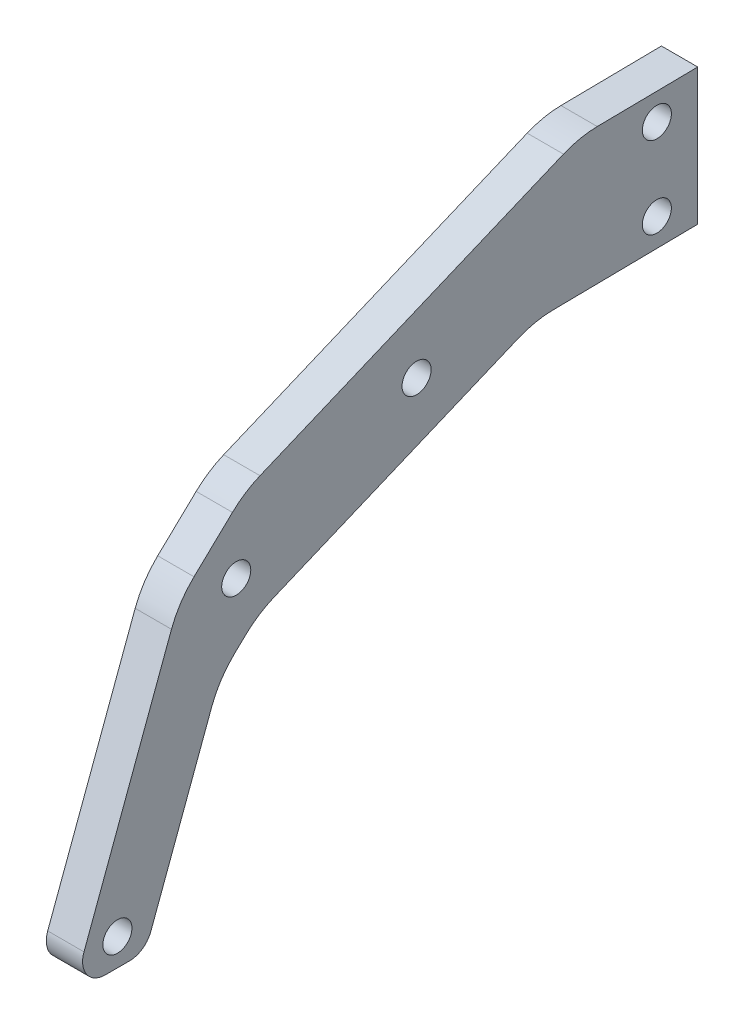
ISO-10303-21;
HEADER;
FILE_DESCRIPTION(('STEP AP214'),'2;1');
FILE_NAME('part.step','',(''),(''),'','','');
FILE_SCHEMA(('AUTOMOTIVE_DESIGN { 1 0 10303 214 1 1 1 1 }'));
ENDSEC;
DATA;
#1=APPLICATION_CONTEXT('core data for automotive mechanical design processes');
#2=APPLICATION_PROTOCOL_DEFINITION('international standard','automotive_design',2000,#1);
#3=PRODUCT_CONTEXT('',#1,'mechanical');
#4=PRODUCT('Part','Part','',(#3));
#5=PRODUCT_RELATED_PRODUCT_CATEGORY('part','',(#4));
#6=PRODUCT_DEFINITION_FORMATION('','',#4);
#7=PRODUCT_DEFINITION_CONTEXT('part definition',#1,'design');
#8=PRODUCT_DEFINITION('design','',#6,#7);
#9=PRODUCT_DEFINITION_SHAPE('','',#8);
#10=(LENGTH_UNIT() NAMED_UNIT(*) SI_UNIT(.MILLI.,.METRE.));
#11=(NAMED_UNIT(*) PLANE_ANGLE_UNIT() SI_UNIT($,.RADIAN.));
#12=(NAMED_UNIT(*) SI_UNIT($,.STERADIAN.) SOLID_ANGLE_UNIT());
#13=UNCERTAINTY_MEASURE_WITH_UNIT(LENGTH_MEASURE(1.E-05),#10,'distance_accuracy_value','');
#14=(GEOMETRIC_REPRESENTATION_CONTEXT(3) GLOBAL_UNCERTAINTY_ASSIGNED_CONTEXT((#13)) GLOBAL_UNIT_ASSIGNED_CONTEXT((#10,
#11,#12)) REPRESENTATION_CONTEXT('',''));
#15=CARTESIAN_POINT('',(0.,0.,0.));
#16=DIRECTION('',(0.,0.,1.));
#17=DIRECTION('',(1.,0.,0.));
#18=AXIS2_PLACEMENT_3D('',#15,#16,#17);
#19=CARTESIAN_POINT('',(4.,2.5,-3.59462739380501));
#20=DIRECTION('',(-1.,0.,0.));
#21=DIRECTION('',(0.,0.,1.));
#22=AXIS2_PLACEMENT_3D('',#19,#20,#21);
#23=PLANE('',#22);
#24=DIRECTION('',(0.,0.0132900137336063,-0.999911683867611));
#25=VECTOR('',#24,1.);
#26=CARTESIAN_POINT('',(4.,53.8051182990518,-55.8458679931572));
#27=LINE('',#26,#25);
#28=CARTESIAN_POINT('',(4.,53.830845917127,-57.7815579350252));
#29=VERTEX_POINT('',#28);
#30=CARTESIAN_POINT('',(4.,53.9778884775887,-68.8447198834361));
#31=VERTEX_POINT('',#30);
#32=EDGE_CURVE('E388',#29,#31,#27,.T.);
#33=ORIENTED_EDGE('',*,*,#32,.F.);
#34=CARTESIAN_POINT('',(4.,43.8317290784509,-57.9144580723613));
#35=DIRECTION('',(-1.,0.,0.));
#36=DIRECTION('',(0.,0.,1.));
#37=AXIS2_PLACEMENT_3D('',#34,#35,#36);
#38=CIRCLE('',#37,10.);
#39=CARTESIAN_POINT('',(4.,53.0588754205989,-54.0596208020497));
#40=VERTEX_POINT('',#39);
#41=EDGE_CURVE('E461',#29,#40,#38,.F.);
#42=ORIENTED_EDGE('',*,*,#41,.T.);
#43=DIRECTION('',(0.,0.385483727031166,-0.922714634214805));
#44=VECTOR('',#43,1.);
#45=CARTESIAN_POINT('',(4.,38.3857692178052,-18.9372826245649));
#46=LINE('',#45,#44);
#47=CARTESIAN_POINT('',(4.,39.0961716849549,-20.6377402746706));
#48=VERTEX_POINT('',#47);
#49=EDGE_CURVE('E385',#48,#40,#46,.T.);
#50=ORIENTED_EDGE('',*,*,#49,.F.);
#51=CARTESIAN_POINT('',(4.,29.8690253428069,-24.4925775449823));
#52=DIRECTION('',(-1.,0.,0.));
#53=DIRECTION('',(0.,0.,1.));
#54=AXIS2_PLACEMENT_3D('',#51,#52,#53);
#55=CIRCLE('',#54,10.);
#56=CARTESIAN_POINT('',(4.,37.1158723932605,-17.6017715088693));
#57=VERTEX_POINT('',#56);
#58=EDGE_CURVE('E249',#48,#57,#55,.F.);
#59=ORIENTED_EDGE('',*,*,#58,.T.);
#60=DIRECTION('',(0.,0.6890806036113,-0.724684705045364));
#61=VECTOR('',#60,1.);
#62=CARTESIAN_POINT('',(4.,31.4949631816922,-11.6904355741113));
#63=LINE('',#62,#61);
#64=CARTESIAN_POINT('',(4.,33.0908033857387,-13.3687312357627));
#65=VERTEX_POINT('',#64);
#66=EDGE_CURVE('E371',#65,#57,#63,.T.);
#67=ORIENTED_EDGE('',*,*,#66,.F.);
#68=CARTESIAN_POINT('',(4.,25.843956335285,-20.2595372718757));
#69=DIRECTION('',(-1.,0.,0.));
#70=DIRECTION('',(0.,0.,1.));
#71=AXIS2_PLACEMENT_3D('',#68,#69,#70);
#72=CIRCLE('',#71,10.);
#73=CARTESIAN_POINT('',(4.,29.3238090620538,-10.8845372718757));
#74=VERTEX_POINT('',#73);
#75=EDGE_CURVE('E243',#65,#74,#72,.F.);
#76=ORIENTED_EDGE('',*,*,#75,.T.);
#77=DIRECTION('',(0.,0.9375,-0.347985272676877));
#78=VECTOR('',#77,1.);
#79=CARTESIAN_POINT('',(4.,3.36996318169219,-1.25087739380501));
#80=LINE('',#79,#78);
#81=CARTESIAN_POINT('',(4.,3.36996318169219,-1.25087739380501));
#82=VERTEX_POINT('',#81);
#83=EDGE_CURVE('E356',#82,#74,#80,.T.);
#84=ORIENTED_EDGE('',*,*,#83,.F.);
#85=CARTESIAN_POINT('',(4.,2.5,-3.59462739380501));
#86=DIRECTION('',(-1.,0.,0.));
#87=DIRECTION('',(0.,0.,1.));
#88=AXIS2_PLACEMENT_3D('',#85,#86,#87);
#89=CIRCLE('',#88,2.5);
#90=CARTESIAN_POINT('',(4.,0.,-3.59462739380501));
#91=VERTEX_POINT('',#90);
#92=EDGE_CURVE('E370',#91,#82,#89,.T.);
#93=ORIENTED_EDGE('',*,*,#92,.F.);
#94=DIRECTION('',(0.,0.,-1.));
#95=VECTOR('',#94,1.);
#96=CARTESIAN_POINT('',(4.,0.,-3.59462739380501));
#97=LINE('',#96,#95);
#98=CARTESIAN_POINT('',(4.,0.,-6.26129406047167));
#99=VERTEX_POINT('',#98);
#100=EDGE_CURVE('E365',#91,#99,#97,.T.);
#101=ORIENTED_EDGE('',*,*,#100,.T.);
#102=CARTESIAN_POINT('',(4.,2.5,-6.26129406047167));
#103=DIRECTION('',(1.,0.,0.));
#104=DIRECTION('',(0.,0.,-1.));
#105=AXIS2_PLACEMENT_3D('',#102,#103,#104);
#106=CIRCLE('',#105,2.5);
#107=CARTESIAN_POINT('',(4.,1.63003681830781,-8.60504406047167));
#108=VERTEX_POINT('',#107);
#109=EDGE_CURVE('E404',#99,#108,#106,.T.);
#110=ORIENTED_EDGE('',*,*,#109,.T.);
#111=DIRECTION('',(0.,0.9375,-0.347985272676877));
#112=VECTOR('',#111,1.);
#113=CARTESIAN_POINT('',(4.,1.63003681830781,-8.60504406047167));
#114=LINE('',#113,#112);
#115=CARTESIAN_POINT('',(4.,19.7540268851558,-15.3323844609038));
#116=VERTEX_POINT('',#115);
#117=EDGE_CURVE('E401',#108,#116,#114,.T.);
#118=ORIENTED_EDGE('',*,*,#117,.T.);
#119=CARTESIAN_POINT('',(4.,16.274174158387,-24.7073844609038));
#120=DIRECTION('',(-1.,0.,0.));
#121=DIRECTION('',(0.,0.,1.));
#122=AXIS2_PLACEMENT_3D('',#119,#120,#121);
#123=CIRCLE('',#122,10.);
#124=CARTESIAN_POINT('',(4.,23.5210212088407,-17.8165784247908));
#125=VERTEX_POINT('',#124);
#126=EDGE_CURVE('E487',#116,#125,#123,.T.);
#127=ORIENTED_EDGE('',*,*,#126,.T.);
#128=DIRECTION('',(0.,0.6890806036113,-0.724684705045364));
#129=VECTOR('',#128,1.);
#130=CARTESIAN_POINT('',(4.,21.9251810047942,-16.1382827631394));
#131=LINE('',#130,#129);
#132=CARTESIAN_POINT('',(4.,24.7329998042288,-19.0911787347068));
#133=VERTEX_POINT('',#132);
#134=EDGE_CURVE('E398',#125,#133,#131,.T.);
#135=ORIENTED_EDGE('',*,*,#134,.T.);
#136=CARTESIAN_POINT('',(4.,17.4861527537751,-25.9819847708198));
#137=DIRECTION('',(-1.,0.,0.));
#138=DIRECTION('',(0.,0.,1.));
#139=AXIS2_PLACEMENT_3D('',#136,#137,#138);
#140=CIRCLE('',#139,10.);
#141=CARTESIAN_POINT('',(4.,26.7132990959232,-22.1271475005082));
#142=VERTEX_POINT('',#141);
#143=EDGE_CURVE('E491',#133,#142,#140,.T.);
#144=ORIENTED_EDGE('',*,*,#143,.T.);
#145=DIRECTION('',(0.,0.385483727031166,-0.922714634214805));
#146=VECTOR('',#145,1.);
#147=CARTESIAN_POINT('',(4.,26.0028966287734,-20.4266898504025));
#148=LINE('',#147,#146);
#149=CARTESIAN_POINT('',(4.,37.9933232946767,-49.1276216389288));
#150=VERTEX_POINT('',#149);
#151=EDGE_CURVE('E395',#142,#150,#148,.T.);
#152=ORIENTED_EDGE('',*,*,#151,.T.);
#153=CARTESIAN_POINT('',(4.,28.7661769525286,-52.9824589092405));
#154=DIRECTION('',(-1.,0.,0.));
#155=DIRECTION('',(0.,0.,1.));
#156=AXIS2_PLACEMENT_3D('',#153,#154,#155);
#157=CIRCLE('',#156,10.);
#158=CARTESIAN_POINT('',(4.,38.7652937912047,-52.8495587719044));
#159=VERTEX_POINT('',#158);
#160=EDGE_CURVE('E12',#150,#159,#157,.T.);
#161=ORIENTED_EDGE('',*,*,#160,.T.);
#162=DIRECTION('',(0.,0.0132900137336063,-0.999911683867611));
#163=VECTOR('',#162,1.);
#164=CARTESIAN_POINT('',(4.,38.7395661731296,-50.9138688300363));
#165=LINE('',#164,#163);
#166=CARTESIAN_POINT('',(4.,38.9778884775887,-68.8447198834361));
#167=VERTEX_POINT('',#166);
#168=EDGE_CURVE('E393',#159,#167,#165,.T.);
#169=ORIENTED_EDGE('',*,*,#168,.T.);
#170=DIRECTION('',(0.,1.,0.));
#171=VECTOR('',#170,1.);
#172=CARTESIAN_POINT('',(4.,38.9778884775887,-68.8447198834361));
#173=LINE('',#172,#171);
#174=EDGE_CURVE('E390',#167,#31,#173,.T.);
#175=ORIENTED_EDGE('',*,*,#174,.T.);
#176=EDGE_LOOP('',(#33,#42,#50,#59,#67,#76,#84,#93,#101,#110,#118,#127,#135,#144,#152,#161,#169,#175));
#177=FACE_BOUND('',#176,.T.);
#178=CARTESIAN_POINT('',(4.,50.9778884775887,-64.3447198834361));
#179=DIRECTION('',(1.,0.,0.));
#180=DIRECTION('',(0.,0.,-1.));
#181=AXIS2_PLACEMENT_3D('',#178,#179,#180);
#182=CIRCLE('',#181,1.60000000000001);
#183=CARTESIAN_POINT('',(4.,50.9778884775887,-65.9447198834361));
#184=VERTEX_POINT('',#183);
#185=EDGE_CURVE('E409',#184,#184,#182,.T.);
#186=ORIENTED_EDGE('',*,*,#185,.F.);
#187=EDGE_LOOP('',(#186));
#188=FACE_BOUND('',#187,.T.);
#189=CARTESIAN_POINT('',(4.,39.7969306114033,-37.8799739940544));
#190=DIRECTION('',(1.,0.,0.));
#191=DIRECTION('',(0.,0.,-1.));
#192=AXIS2_PLACEMENT_3D('',#189,#190,#191);
#193=CIRCLE('',#192,1.60000000000001);
#194=CARTESIAN_POINT('',(4.,39.7969306114033,-39.4799739940544));
#195=VERTEX_POINT('',#194);
#196=EDGE_CURVE('E799',#195,#195,#193,.T.);
#197=ORIENTED_EDGE('',*,*,#196,.F.);
#198=EDGE_LOOP('',(#197));
#199=FACE_BOUND('',#198,.T.);
#200=CARTESIAN_POINT('',(4.,30.6110687670648,-18.0169164153912));
#201=DIRECTION('',(1.,0.,0.));
#202=DIRECTION('',(0.,0.,-1.));
#203=AXIS2_PLACEMENT_3D('',#200,#201,#202);
#204=CIRCLE('',#203,1.6);
#205=CARTESIAN_POINT('',(4.,30.6110687670648,-19.6169164153912));
#206=VERTEX_POINT('',#205);
#207=EDGE_CURVE('E805',#206,#206,#204,.T.);
#208=ORIENTED_EDGE('',*,*,#207,.F.);
#209=EDGE_LOOP('',(#208));
#210=FACE_BOUND('',#209,.T.);
#211=CARTESIAN_POINT('',(4.,3.,-4.92796072713834));
#212=DIRECTION('',(1.,0.,0.));
#213=DIRECTION('',(0.,0.,-1.));
#214=AXIS2_PLACEMENT_3D('',#211,#212,#213);
#215=CIRCLE('',#214,1.6);
#216=CARTESIAN_POINT('',(4.,3.,-6.52796072713834));
#217=VERTEX_POINT('',#216);
#218=EDGE_CURVE('E811',#217,#217,#215,.T.);
#219=ORIENTED_EDGE('',*,*,#218,.F.);
#220=EDGE_LOOP('',(#219));
#221=FACE_BOUND('',#220,.T.);
#222=CARTESIAN_POINT('',(4.,41.9778895515992,-64.3403230449873));
#223=DIRECTION('',(1.,0.,0.));
#224=DIRECTION('',(0.,0.,-1.));
#225=AXIS2_PLACEMENT_3D('',#222,#223,#224);
#226=CIRCLE('',#225,1.60000000000001);
#227=CARTESIAN_POINT('',(4.,41.9778895515992,-65.9403230449873));
#228=VERTEX_POINT('',#227);
#229=EDGE_CURVE('E817',#228,#228,#226,.T.);
#230=ORIENTED_EDGE('',*,*,#229,.F.);
#231=EDGE_LOOP('',(#230));
#232=FACE_BOUND('',#231,.T.);
#233=ADVANCED_FACE('F228',(#177,#188,#199,#210,#221,#232),#23,.F.);
#234=CARTESIAN_POINT('',(0.,2.5,-3.59462739380501));
#235=DIRECTION('',(-1.,0.,0.));
#236=DIRECTION('',(0.,0.,1.));
#237=AXIS2_PLACEMENT_3D('',#234,#235,#236);
#238=PLANE('',#237);
#239=CARTESIAN_POINT('',(0.,3.,-4.92796072713834));
#240=DIRECTION('',(1.,0.,0.));
#241=DIRECTION('',(0.,0.,-1.));
#242=AXIS2_PLACEMENT_3D('',#239,#240,#241);
#243=CIRCLE('',#242,1.6);
#244=CARTESIAN_POINT('',(0.,3.,-6.52796072713834));
#245=VERTEX_POINT('',#244);
#246=EDGE_CURVE('E814',#245,#245,#243,.T.);
#247=ORIENTED_EDGE('',*,*,#246,.T.);
#248=EDGE_LOOP('',(#247));
#249=FACE_BOUND('',#248,.T.);
#250=CARTESIAN_POINT('',(0.,39.7969306114033,-37.8799739940544));
#251=DIRECTION('',(1.,0.,0.));
#252=DIRECTION('',(0.,0.,-1.));
#253=AXIS2_PLACEMENT_3D('',#250,#251,#252);
#254=CIRCLE('',#253,1.60000000000001);
#255=CARTESIAN_POINT('',(0.,39.7969306114033,-39.4799739940544));
#256=VERTEX_POINT('',#255);
#257=EDGE_CURVE('E801',#256,#256,#254,.T.);
#258=ORIENTED_EDGE('',*,*,#257,.T.);
#259=EDGE_LOOP('',(#258));
#260=FACE_BOUND('',#259,.T.);
#261=DIRECTION('',(0.,0.385483727031166,-0.922714634214805));
#262=VECTOR('',#261,1.);
#263=CARTESIAN_POINT('',(0.,38.3857692178052,-18.9372826245649));
#264=LINE('',#263,#262);
#265=CARTESIAN_POINT('',(0.,39.0961716849549,-20.6377402746706));
#266=VERTEX_POINT('',#265);
#267=CARTESIAN_POINT('',(0.,53.0588754205989,-54.0596208020497));
#268=VERTEX_POINT('',#267);
#269=EDGE_CURVE('E414',#266,#268,#264,.T.);
#270=ORIENTED_EDGE('',*,*,#269,.T.);
#271=CARTESIAN_POINT('',(0.,43.8317290784509,-57.9144580723613));
#272=DIRECTION('',(-1.,0.,0.));
#273=DIRECTION('',(0.,0.,1.));
#274=AXIS2_PLACEMENT_3D('',#271,#272,#273);
#275=CIRCLE('',#274,10.);
#276=CARTESIAN_POINT('',(0.,53.830845917127,-57.7815579350252));
#277=VERTEX_POINT('',#276);
#278=EDGE_CURVE('E455',#268,#277,#275,.T.);
#279=ORIENTED_EDGE('',*,*,#278,.T.);
#280=DIRECTION('',(0.,0.0132900137336063,-0.999911683867611));
#281=VECTOR('',#280,1.);
#282=CARTESIAN_POINT('',(0.,53.8051182990518,-55.8458679931572));
#283=LINE('',#282,#281);
#284=CARTESIAN_POINT('',(0.,53.9778884775887,-68.8447198834361));
#285=VERTEX_POINT('',#284);
#286=EDGE_CURVE('E417',#277,#285,#283,.T.);
#287=ORIENTED_EDGE('',*,*,#286,.T.);
#288=DIRECTION('',(0.,1.,0.));
#289=VECTOR('',#288,1.);
#290=CARTESIAN_POINT('',(0.,38.9778884775887,-68.8447198834361));
#291=LINE('',#290,#289);
#292=CARTESIAN_POINT('',(0.,38.9778884775887,-68.8447198834361));
#293=VERTEX_POINT('',#292);
#294=EDGE_CURVE('E419',#293,#285,#291,.T.);
#295=ORIENTED_EDGE('',*,*,#294,.F.);
#296=DIRECTION('',(0.,0.0132900137336063,-0.999911683867611));
#297=VECTOR('',#296,1.);
#298=CARTESIAN_POINT('',(0.,38.7395661731296,-50.9138688300363));
#299=LINE('',#298,#297);
#300=CARTESIAN_POINT('',(0.,38.7652937912047,-52.8495587719044));
#301=VERTEX_POINT('',#300);
#302=EDGE_CURVE('E422',#301,#293,#299,.T.);
#303=ORIENTED_EDGE('',*,*,#302,.F.);
#304=CARTESIAN_POINT('',(0.,28.7661769525286,-52.9824589092405));
#305=DIRECTION('',(-1.,0.,0.));
#306=DIRECTION('',(0.,0.,1.));
#307=AXIS2_PLACEMENT_3D('',#304,#305,#306);
#308=CIRCLE('',#307,10.);
#309=CARTESIAN_POINT('',(0.,37.9933232946767,-49.1276216389288));
#310=VERTEX_POINT('',#309);
#311=EDGE_CURVE('E236',#301,#310,#308,.F.);
#312=ORIENTED_EDGE('',*,*,#311,.T.);
#313=DIRECTION('',(0.,0.385483727031166,-0.922714634214805));
#314=VECTOR('',#313,1.);
#315=CARTESIAN_POINT('',(0.,26.0028966287734,-20.4266898504025));
#316=LINE('',#315,#314);
#317=CARTESIAN_POINT('',(0.,26.7132990959232,-22.1271475005082));
#318=VERTEX_POINT('',#317);
#319=EDGE_CURVE('E424',#318,#310,#316,.T.);
#320=ORIENTED_EDGE('',*,*,#319,.F.);
#321=CARTESIAN_POINT('',(0.,17.4861527537751,-25.9819847708198));
#322=DIRECTION('',(-1.,0.,0.));
#323=DIRECTION('',(0.,0.,1.));
#324=AXIS2_PLACEMENT_3D('',#321,#322,#323);
#325=CIRCLE('',#324,10.);
#326=CARTESIAN_POINT('',(0.,24.7329998042288,-19.0911787347068));
#327=VERTEX_POINT('',#326);
#328=EDGE_CURVE('E489',#318,#327,#325,.F.);
#329=ORIENTED_EDGE('',*,*,#328,.T.);
#330=DIRECTION('',(0.,0.6890806036113,-0.724684705045364));
#331=VECTOR('',#330,1.);
#332=CARTESIAN_POINT('',(0.,21.9251810047942,-16.1382827631394));
#333=LINE('',#332,#331);
#334=CARTESIAN_POINT('',(0.,23.5210212088407,-17.8165784247908));
#335=VERTEX_POINT('',#334);
#336=EDGE_CURVE('E427',#335,#327,#333,.T.);
#337=ORIENTED_EDGE('',*,*,#336,.F.);
#338=CARTESIAN_POINT('',(0.,16.274174158387,-24.7073844609038));
#339=DIRECTION('',(-1.,0.,0.));
#340=DIRECTION('',(0.,0.,1.));
#341=AXIS2_PLACEMENT_3D('',#338,#339,#340);
#342=CIRCLE('',#341,10.);
#343=CARTESIAN_POINT('',(0.,19.7540268851558,-15.3323844609038));
#344=VERTEX_POINT('',#343);
#345=EDGE_CURVE('E485',#335,#344,#342,.F.);
#346=ORIENTED_EDGE('',*,*,#345,.T.);
#347=DIRECTION('',(0.,0.9375,-0.347985272676877));
#348=VECTOR('',#347,1.);
#349=CARTESIAN_POINT('',(0.,1.63003681830781,-8.60504406047167));
#350=LINE('',#349,#348);
#351=CARTESIAN_POINT('',(0.,1.63003681830781,-8.60504406047167));
#352=VERTEX_POINT('',#351);
#353=EDGE_CURVE('E430',#352,#344,#350,.T.);
#354=ORIENTED_EDGE('',*,*,#353,.F.);
#355=CARTESIAN_POINT('',(0.,2.5,-6.26129406047167));
#356=DIRECTION('',(1.,0.,0.));
#357=DIRECTION('',(0.,0.,-1.));
#358=AXIS2_PLACEMENT_3D('',#355,#356,#357);
#359=CIRCLE('',#358,2.5);
#360=CARTESIAN_POINT('',(0.,0.,-6.26129406047167));
#361=VERTEX_POINT('',#360);
#362=EDGE_CURVE('E378',#361,#352,#359,.T.);
#363=ORIENTED_EDGE('',*,*,#362,.F.);
#364=DIRECTION('',(0.,0.,-1.));
#365=VECTOR('',#364,1.);
#366=CARTESIAN_POINT('',(0.,0.,-3.59462739380501));
#367=LINE('',#366,#365);
#368=CARTESIAN_POINT('',(0.,0.,-3.59462739380501));
#369=VERTEX_POINT('',#368);
#370=EDGE_CURVE('E376',#369,#361,#367,.T.);
#371=ORIENTED_EDGE('',*,*,#370,.F.);
#372=CARTESIAN_POINT('',(0.,2.5,-3.59462739380501));
#373=DIRECTION('',(-1.,0.,0.));
#374=DIRECTION('',(0.,0.,1.));
#375=AXIS2_PLACEMENT_3D('',#372,#373,#374);
#376=CIRCLE('',#375,2.5);
#377=CARTESIAN_POINT('',(0.,3.36996318169219,-1.25087739380501));
#378=VERTEX_POINT('',#377);
#379=EDGE_CURVE('E407',#369,#378,#376,.T.);
#380=ORIENTED_EDGE('',*,*,#379,.T.);
#381=DIRECTION('',(0.,0.9375,-0.347985272676877));
#382=VECTOR('',#381,1.);
#383=CARTESIAN_POINT('',(0.,3.36996318169219,-1.25087739380501));
#384=LINE('',#383,#382);
#385=CARTESIAN_POINT('',(0.,29.3238090620538,-10.8845372718757));
#386=VERTEX_POINT('',#385);
#387=EDGE_CURVE('E359',#378,#386,#384,.T.);
#388=ORIENTED_EDGE('',*,*,#387,.T.);
#389=CARTESIAN_POINT('',(0.,25.843956335285,-20.2595372718757));
#390=DIRECTION('',(-1.,0.,0.));
#391=DIRECTION('',(0.,0.,1.));
#392=AXIS2_PLACEMENT_3D('',#389,#390,#391);
#393=CIRCLE('',#392,10.);
#394=CARTESIAN_POINT('',(0.,33.0908033857387,-13.3687312357627));
#395=VERTEX_POINT('',#394);
#396=EDGE_CURVE('E453',#386,#395,#393,.T.);
#397=ORIENTED_EDGE('',*,*,#396,.T.);
#398=DIRECTION('',(0.,0.6890806036113,-0.724684705045364));
#399=VECTOR('',#398,1.);
#400=CARTESIAN_POINT('',(0.,31.4949631816922,-11.6904355741113));
#401=LINE('',#400,#399);
#402=CARTESIAN_POINT('',(0.,37.1158723932605,-17.6017715088693));
#403=VERTEX_POINT('',#402);
#404=EDGE_CURVE('E411',#395,#403,#401,.T.);
#405=ORIENTED_EDGE('',*,*,#404,.T.);
#406=CARTESIAN_POINT('',(0.,29.8690253428069,-24.4925775449823));
#407=DIRECTION('',(-1.,0.,0.));
#408=DIRECTION('',(0.,0.,1.));
#409=AXIS2_PLACEMENT_3D('',#406,#407,#408);
#410=CIRCLE('',#409,10.);
#411=EDGE_CURVE('E451',#403,#266,#410,.T.);
#412=ORIENTED_EDGE('',*,*,#411,.T.);
#413=EDGE_LOOP('',(#270,#279,#287,#295,#303,#312,#320,#329,#337,#346,#354,#363,#371,#380,#388,
#397,#405,#412));
#414=FACE_BOUND('',#413,.T.);
#415=CARTESIAN_POINT('',(0.,50.9778884775887,-64.3447198834361));
#416=DIRECTION('',(1.,0.,0.));
#417=DIRECTION('',(0.,0.,-1.));
#418=AXIS2_PLACEMENT_3D('',#415,#416,#417);
#419=CIRCLE('',#418,1.60000000000001);
#420=CARTESIAN_POINT('',(0.,50.9778884775887,-65.9447198834361));
#421=VERTEX_POINT('',#420);
#422=EDGE_CURVE('E381',#421,#421,#419,.T.);
#423=ORIENTED_EDGE('',*,*,#422,.T.);
#424=EDGE_LOOP('',(#423));
#425=FACE_BOUND('',#424,.T.);
#426=CARTESIAN_POINT('',(0.,30.6110687670648,-18.0169164153912));
#427=DIRECTION('',(1.,0.,0.));
#428=DIRECTION('',(0.,0.,-1.));
#429=AXIS2_PLACEMENT_3D('',#426,#427,#428);
#430=CIRCLE('',#429,1.6);
#431=CARTESIAN_POINT('',(0.,30.6110687670648,-19.6169164153912));
#432=VERTEX_POINT('',#431);
#433=EDGE_CURVE('E808',#432,#432,#430,.T.);
#434=ORIENTED_EDGE('',*,*,#433,.T.);
#435=EDGE_LOOP('',(#434));
#436=FACE_BOUND('',#435,.T.);
#437=CARTESIAN_POINT('',(0.,41.9778895515992,-64.3403230449873));
#438=DIRECTION('',(1.,0.,0.));
#439=DIRECTION('',(0.,0.,-1.));
#440=AXIS2_PLACEMENT_3D('',#437,#438,#439);
#441=CIRCLE('',#440,1.60000000000001);
#442=CARTESIAN_POINT('',(0.,41.9778895515992,-65.9403230449873));
#443=VERTEX_POINT('',#442);
#444=EDGE_CURVE('E820',#443,#443,#441,.T.);
#445=ORIENTED_EDGE('',*,*,#444,.T.);
#446=EDGE_LOOP('',(#445));
#447=FACE_BOUND('',#446,.T.);
#448=ADVANCED_FACE('F495',(#249,#260,#414,#425,#436,#447),#238,.T.);
#449=CARTESIAN_POINT('',(4.,2.5,-3.59462739380501));
#450=DIRECTION('',(-1.,0.,0.));
#451=DIRECTION('',(0.,0.,1.));
#452=AXIS2_PLACEMENT_3D('',#449,#450,#451);
#453=CYLINDRICAL_SURFACE('',#452,2.5);
#454=ORIENTED_EDGE('',*,*,#379,.F.);
#455=DIRECTION('',(-1.,0.,0.));
#456=VECTOR('',#455,1.);
#457=CARTESIAN_POINT('',(4.,0.,-3.59462739380501));
#458=LINE('',#457,#456);
#459=EDGE_CURVE('E374',#91,#369,#458,.T.);
#460=ORIENTED_EDGE('',*,*,#459,.F.);
#461=ORIENTED_EDGE('',*,*,#92,.T.);
#462=DIRECTION('',(-1.,0.,0.));
#463=VECTOR('',#462,1.);
#464=CARTESIAN_POINT('',(4.,3.36996318169219,-1.25087739380501));
#465=LINE('',#464,#463);
#466=EDGE_CURVE('E353',#82,#378,#465,.T.);
#467=ORIENTED_EDGE('',*,*,#466,.T.);
#468=EDGE_LOOP('',(#454,#460,#461,#467));
#469=FACE_BOUND('',#468,.T.);
#470=ADVANCED_FACE('F373',(#469),#453,.T.);
#471=CARTESIAN_POINT('',(4.,0.,-3.59462739380501));
#472=DIRECTION('',(0.,1.,0.));
#473=DIRECTION('',(0.,0.,1.));
#474=AXIS2_PLACEMENT_3D('',#471,#472,#473);
#475=PLANE('',#474);
#476=ORIENTED_EDGE('',*,*,#370,.T.);
#477=DIRECTION('',(-1.,0.,0.));
#478=VECTOR('',#477,1.);
#479=CARTESIAN_POINT('',(4.,0.,-6.26129406047167));
#480=LINE('',#479,#478);
#481=EDGE_CURVE('E436',#99,#361,#480,.T.);
#482=ORIENTED_EDGE('',*,*,#481,.F.);
#483=ORIENTED_EDGE('',*,*,#100,.F.);
#484=ORIENTED_EDGE('',*,*,#459,.T.);
#485=EDGE_LOOP('',(#476,#482,#483,#484));
#486=FACE_BOUND('',#485,.T.);
#487=ADVANCED_FACE('F539',(#486),#475,.F.);
#488=CARTESIAN_POINT('',(4.,2.5,-6.26129406047167));
#489=DIRECTION('',(-1.,0.,0.));
#490=DIRECTION('',(0.,0.,1.));
#491=AXIS2_PLACEMENT_3D('',#488,#489,#490);
#492=CYLINDRICAL_SURFACE('',#491,2.5);
#493=ORIENTED_EDGE('',*,*,#362,.T.);
#494=DIRECTION('',(-1.,0.,0.));
#495=VECTOR('',#494,1.);
#496=CARTESIAN_POINT('',(4.,1.63003681830781,-8.60504406047167));
#497=LINE('',#496,#495);
#498=EDGE_CURVE('E439',#108,#352,#497,.T.);
#499=ORIENTED_EDGE('',*,*,#498,.F.);
#500=ORIENTED_EDGE('',*,*,#109,.F.);
#501=ORIENTED_EDGE('',*,*,#481,.T.);
#502=EDGE_LOOP('',(#493,#499,#500,#501));
#503=FACE_BOUND('',#502,.T.);
#504=ADVANCED_FACE('F542',(#503),#492,.T.);
#505=CARTESIAN_POINT('',(4.,1.63003681830781,-8.60504406047167));
#506=DIRECTION('',(0.,0.347985272676877,0.9375));
#507=DIRECTION('',(0.,-0.9375,0.347985272676877));
#508=AXIS2_PLACEMENT_3D('',#505,#506,#507);
#509=PLANE('',#508);
#510=ORIENTED_EDGE('',*,*,#353,.T.);
#511=DIRECTION('',(-1.,0.,0.));
#512=VECTOR('',#511,1.);
#513=CARTESIAN_POINT('',(4.,19.7540268851558,-15.3323844609038));
#514=LINE('',#513,#512);
#515=EDGE_CURVE('E475',#344,#116,#514,.F.);
#516=ORIENTED_EDGE('',*,*,#515,.T.);
#517=ORIENTED_EDGE('',*,*,#117,.F.);
#518=ORIENTED_EDGE('',*,*,#498,.T.);
#519=EDGE_LOOP('',(#510,#516,#517,#518));
#520=FACE_BOUND('',#519,.T.);
#521=ADVANCED_FACE('F580',(#520),#509,.F.);
#522=CARTESIAN_POINT('',(4.,21.9251810047942,-16.1382827631394));
#523=DIRECTION('',(0.,0.724684705045364,0.6890806036113));
#524=DIRECTION('',(0.,-0.6890806036113,0.724684705045364));
#525=AXIS2_PLACEMENT_3D('',#522,#523,#524);
#526=PLANE('',#525);
#527=ORIENTED_EDGE('',*,*,#134,.F.);
#528=DIRECTION('',(-1.,0.,0.));
#529=VECTOR('',#528,1.);
#530=CARTESIAN_POINT('',(0.,23.5210212088407,-17.8165784247908));
#531=LINE('',#530,#529);
#532=EDGE_CURVE('E472',#125,#335,#531,.T.);
#533=ORIENTED_EDGE('',*,*,#532,.T.);
#534=ORIENTED_EDGE('',*,*,#336,.T.);
#535=DIRECTION('',(-1.,0.,0.));
#536=VECTOR('',#535,1.);
#537=CARTESIAN_POINT('',(4.,24.7329998042288,-19.0911787347068));
#538=LINE('',#537,#536);
#539=EDGE_CURVE('E470',#327,#133,#538,.F.);
#540=ORIENTED_EDGE('',*,*,#539,.T.);
#541=EDGE_LOOP('',(#527,#533,#534,#540));
#542=FACE_BOUND('',#541,.T.);
#543=ADVANCED_FACE('F554',(#542),#526,.F.);
#544=CARTESIAN_POINT('',(4.,26.0028966287734,-20.4266898504025));
#545=DIRECTION('',(0.,0.922714634214805,0.385483727031166));
#546=DIRECTION('',(0.,-0.385483727031166,0.922714634214805));
#547=AXIS2_PLACEMENT_3D('',#544,#545,#546);
#548=PLANE('',#547);
#549=ORIENTED_EDGE('',*,*,#151,.F.);
#550=DIRECTION('',(-1.,0.,0.));
#551=VECTOR('',#550,1.);
#552=CARTESIAN_POINT('',(0.,26.7132990959232,-22.1271475005082));
#553=LINE('',#552,#551);
#554=EDGE_CURVE('E479',#142,#318,#553,.T.);
#555=ORIENTED_EDGE('',*,*,#554,.T.);
#556=ORIENTED_EDGE('',*,*,#319,.T.);
#557=DIRECTION('',(-1.,0.,0.));
#558=VECTOR('',#557,1.);
#559=CARTESIAN_POINT('',(4.,37.9933232946767,-49.1276216389288));
#560=LINE('',#559,#558);
#561=EDGE_CURVE('E477',#310,#150,#560,.F.);
#562=ORIENTED_EDGE('',*,*,#561,.T.);
#563=EDGE_LOOP('',(#549,#555,#556,#562));
#564=FACE_BOUND('',#563,.T.);
#565=ADVANCED_FACE('F503',(#564),#548,.F.);
#566=CARTESIAN_POINT('',(4.,38.7395661731296,-50.9138688300363));
#567=DIRECTION('',(0.,0.999911683867611,0.0132900137336063));
#568=DIRECTION('',(0.,-0.0132900137336063,0.999911683867611));
#569=AXIS2_PLACEMENT_3D('',#566,#567,#568);
#570=PLANE('',#569);
#571=ORIENTED_EDGE('',*,*,#168,.F.);
#572=DIRECTION('',(-1.,0.,0.));
#573=VECTOR('',#572,1.);
#574=CARTESIAN_POINT('',(0.,38.7652937912047,-52.8495587719044));
#575=LINE('',#574,#573);
#576=EDGE_CURVE('E482',#159,#301,#575,.T.);
#577=ORIENTED_EDGE('',*,*,#576,.T.);
#578=ORIENTED_EDGE('',*,*,#302,.T.);
#579=DIRECTION('',(-1.,0.,0.));
#580=VECTOR('',#579,1.);
#581=CARTESIAN_POINT('',(4.,38.9778884775887,-68.8447198834361));
#582=LINE('',#581,#580);
#583=EDGE_CURVE('E442',#167,#293,#582,.T.);
#584=ORIENTED_EDGE('',*,*,#583,.F.);
#585=EDGE_LOOP('',(#571,#577,#578,#584));
#586=FACE_BOUND('',#585,.T.);
#587=ADVANCED_FACE('F509',(#586),#570,.F.);
#588=CARTESIAN_POINT('',(4.,38.9778884775887,-68.8447198834361));
#589=DIRECTION('',(0.,0.,1.));
#590=DIRECTION('',(0.,-1.,0.));
#591=AXIS2_PLACEMENT_3D('',#588,#589,#590);
#592=PLANE('',#591);
#593=ORIENTED_EDGE('',*,*,#294,.T.);
#594=DIRECTION('',(-1.,0.,0.));
#595=VECTOR('',#594,1.);
#596=CARTESIAN_POINT('',(4.,53.9778884775887,-68.8447198834361));
#597=LINE('',#596,#595);
#598=EDGE_CURVE('E364',#31,#285,#597,.T.);
#599=ORIENTED_EDGE('',*,*,#598,.F.);
#600=ORIENTED_EDGE('',*,*,#174,.F.);
#601=ORIENTED_EDGE('',*,*,#583,.T.);
#602=EDGE_LOOP('',(#593,#599,#600,#601));
#603=FACE_BOUND('',#602,.T.);
#604=ADVANCED_FACE('F513',(#603),#592,.F.);
#605=CARTESIAN_POINT('',(4.,53.8051182990518,-55.8458679931572));
#606=DIRECTION('',(0.,0.999911683867611,0.0132900137336063));
#607=DIRECTION('',(0.,-0.0132900137336063,0.999911683867611));
#608=AXIS2_PLACEMENT_3D('',#605,#606,#607);
#609=PLANE('',#608);
#610=ORIENTED_EDGE('',*,*,#286,.F.);
#611=DIRECTION('',(-1.,0.,0.));
#612=VECTOR('',#611,1.);
#613=CARTESIAN_POINT('',(4.,53.830845917127,-57.7815579350252));
#614=LINE('',#613,#612);
#615=EDGE_CURVE('E457',#277,#29,#614,.F.);
#616=ORIENTED_EDGE('',*,*,#615,.T.);
#617=ORIENTED_EDGE('',*,*,#32,.T.);
#618=ORIENTED_EDGE('',*,*,#598,.T.);
#619=EDGE_LOOP('',(#610,#616,#617,#618));
#620=FACE_BOUND('',#619,.T.);
#621=ADVANCED_FACE('F591',(#620),#609,.T.);
#622=CARTESIAN_POINT('',(4.,38.3857692178052,-18.9372826245649));
#623=DIRECTION('',(0.,0.922714634214805,0.385483727031166));
#624=DIRECTION('',(0.,-0.385483727031166,0.922714634214805));
#625=AXIS2_PLACEMENT_3D('',#622,#623,#624);
#626=PLANE('',#625);
#627=ORIENTED_EDGE('',*,*,#49,.T.);
#628=DIRECTION('',(-1.,0.,0.));
#629=VECTOR('',#628,1.);
#630=CARTESIAN_POINT('',(4.,53.0588754205989,-54.0596208020497));
#631=LINE('',#630,#629);
#632=EDGE_CURVE('E448',#40,#268,#631,.T.);
#633=ORIENTED_EDGE('',*,*,#632,.T.);
#634=ORIENTED_EDGE('',*,*,#269,.F.);
#635=DIRECTION('',(-1.,0.,0.));
#636=VECTOR('',#635,1.);
#637=CARTESIAN_POINT('',(4.,39.0961716849549,-20.6377402746706));
#638=LINE('',#637,#636);
#639=EDGE_CURVE('E435',#266,#48,#638,.F.);
#640=ORIENTED_EDGE('',*,*,#639,.T.);
#641=EDGE_LOOP('',(#627,#633,#634,#640));
#642=FACE_BOUND('',#641,.T.);
#643=ADVANCED_FACE('F522',(#642),#626,.T.);
#644=CARTESIAN_POINT('',(4.,31.4949631816922,-11.6904355741113));
#645=DIRECTION('',(0.,0.724684705045364,0.6890806036113));
#646=DIRECTION('',(0.,-0.6890806036113,0.724684705045364));
#647=AXIS2_PLACEMENT_3D('',#644,#645,#646);
#648=PLANE('',#647);
#649=ORIENTED_EDGE('',*,*,#404,.F.);
#650=DIRECTION('',(-1.,0.,0.));
#651=VECTOR('',#650,1.);
#652=CARTESIAN_POINT('',(4.,33.0908033857387,-13.3687312357627));
#653=LINE('',#652,#651);
#654=EDGE_CURVE('E468',#395,#65,#653,.F.);
#655=ORIENTED_EDGE('',*,*,#654,.T.);
#656=ORIENTED_EDGE('',*,*,#66,.T.);
#657=DIRECTION('',(-1.,0.,0.));
#658=VECTOR('',#657,1.);
#659=CARTESIAN_POINT('',(4.,37.1158723932605,-17.6017715088693));
#660=LINE('',#659,#658);
#661=EDGE_CURVE('E465',#57,#403,#660,.T.);
#662=ORIENTED_EDGE('',*,*,#661,.T.);
#663=EDGE_LOOP('',(#649,#655,#656,#662));
#664=FACE_BOUND('',#663,.T.);
#665=ADVANCED_FACE('F530',(#664),#648,.T.);
#666=CARTESIAN_POINT('',(4.,3.36996318169219,-1.25087739380501));
#667=DIRECTION('',(0.,0.347985272676877,0.9375));
#668=DIRECTION('',(0.,-0.9375,0.347985272676877));
#669=AXIS2_PLACEMENT_3D('',#666,#667,#668);
#670=PLANE('',#669);
#671=ORIENTED_EDGE('',*,*,#83,.T.);
#672=DIRECTION('',(-1.,0.,0.));
#673=VECTOR('',#672,1.);
#674=CARTESIAN_POINT('',(4.,29.3238090620538,-10.8845372718757));
#675=LINE('',#674,#673);
#676=EDGE_CURVE('E463',#74,#386,#675,.T.);
#677=ORIENTED_EDGE('',*,*,#676,.T.);
#678=ORIENTED_EDGE('',*,*,#387,.F.);
#679=ORIENTED_EDGE('',*,*,#466,.F.);
#680=EDGE_LOOP('',(#671,#677,#678,#679));
#681=FACE_BOUND('',#680,.T.);
#682=ADVANCED_FACE('F354',(#681),#670,.T.);
#683=CARTESIAN_POINT('',(4.,50.9778884775887,-64.3447198834361));
#684=DIRECTION('',(-1.,0.,0.));
#685=DIRECTION('',(0.,0.,1.));
#686=AXIS2_PLACEMENT_3D('',#683,#684,#685);
#687=CYLINDRICAL_SURFACE('',#686,1.60000000000001);
#688=ORIENTED_EDGE('',*,*,#185,.T.);
#689=EDGE_LOOP('',(#688));
#690=FACE_BOUND('',#689,.T.);
#691=ORIENTED_EDGE('',*,*,#422,.F.);
#692=EDGE_LOOP('',(#691));
#693=FACE_BOUND('',#692,.T.);
#694=ADVANCED_FACE('F573',(#690,#693),#687,.F.);
#695=CARTESIAN_POINT('',(4.,39.7969306114033,-37.8799739940544));
#696=DIRECTION('',(-1.,0.,0.));
#697=DIRECTION('',(0.,0.,1.));
#698=AXIS2_PLACEMENT_3D('',#695,#696,#697);
#699=CYLINDRICAL_SURFACE('',#698,1.60000000000001);
#700=ORIENTED_EDGE('',*,*,#196,.T.);
#701=EDGE_LOOP('',(#700));
#702=FACE_BOUND('',#701,.T.);
#703=ORIENTED_EDGE('',*,*,#257,.F.);
#704=EDGE_LOOP('',(#703));
#705=FACE_BOUND('',#704,.T.);
#706=ADVANCED_FACE('F666',(#702,#705),#699,.F.);
#707=CARTESIAN_POINT('',(4.,30.6110687670648,-18.0169164153912));
#708=DIRECTION('',(-1.,0.,0.));
#709=DIRECTION('',(0.,0.,1.));
#710=AXIS2_PLACEMENT_3D('',#707,#708,#709);
#711=CYLINDRICAL_SURFACE('',#710,1.6);
#712=ORIENTED_EDGE('',*,*,#207,.T.);
#713=EDGE_LOOP('',(#712));
#714=FACE_BOUND('',#713,.T.);
#715=ORIENTED_EDGE('',*,*,#433,.F.);
#716=EDGE_LOOP('',(#715));
#717=FACE_BOUND('',#716,.T.);
#718=ADVANCED_FACE('F657',(#714,#717),#711,.F.);
#719=CARTESIAN_POINT('',(4.,3.,-4.92796072713834));
#720=DIRECTION('',(-1.,0.,0.));
#721=DIRECTION('',(0.,0.,1.));
#722=AXIS2_PLACEMENT_3D('',#719,#720,#721);
#723=CYLINDRICAL_SURFACE('',#722,1.6);
#724=ORIENTED_EDGE('',*,*,#218,.T.);
#725=EDGE_LOOP('',(#724));
#726=FACE_BOUND('',#725,.T.);
#727=ORIENTED_EDGE('',*,*,#246,.F.);
#728=EDGE_LOOP('',(#727));
#729=FACE_BOUND('',#728,.T.);
#730=ADVANCED_FACE('F648',(#726,#729),#723,.F.);
#731=CARTESIAN_POINT('',(4.,41.9778895515992,-64.3403230449873));
#732=DIRECTION('',(-1.,0.,0.));
#733=DIRECTION('',(0.,0.,1.));
#734=AXIS2_PLACEMENT_3D('',#731,#732,#733);
#735=CYLINDRICAL_SURFACE('',#734,1.60000000000001);
#736=ORIENTED_EDGE('',*,*,#229,.T.);
#737=EDGE_LOOP('',(#736));
#738=FACE_BOUND('',#737,.T.);
#739=ORIENTED_EDGE('',*,*,#444,.F.);
#740=EDGE_LOOP('',(#739));
#741=FACE_BOUND('',#740,.T.);
#742=ADVANCED_FACE('F604',(#738,#741),#735,.F.);
#743=CARTESIAN_POINT('',(4.,43.8317290784509,-57.9144580723613));
#744=DIRECTION('',(-1.,0.,0.));
#745=DIRECTION('',(0.,0.,1.));
#746=AXIS2_PLACEMENT_3D('',#743,#744,#745);
#747=CYLINDRICAL_SURFACE('',#746,10.);
#748=ORIENTED_EDGE('',*,*,#41,.F.);
#749=ORIENTED_EDGE('',*,*,#615,.F.);
#750=ORIENTED_EDGE('',*,*,#278,.F.);
#751=ORIENTED_EDGE('',*,*,#632,.F.);
#752=EDGE_LOOP('',(#748,#749,#750,#751));
#753=FACE_BOUND('',#752,.T.);
#754=ADVANCED_FACE('F519',(#753),#747,.T.);
#755=CARTESIAN_POINT('',(4.,25.843956335285,-20.2595372718757));
#756=DIRECTION('',(-1.,0.,0.));
#757=DIRECTION('',(0.,0.,1.));
#758=AXIS2_PLACEMENT_3D('',#755,#756,#757);
#759=CYLINDRICAL_SURFACE('',#758,10.);
#760=ORIENTED_EDGE('',*,*,#75,.F.);
#761=ORIENTED_EDGE('',*,*,#654,.F.);
#762=ORIENTED_EDGE('',*,*,#396,.F.);
#763=ORIENTED_EDGE('',*,*,#676,.F.);
#764=EDGE_LOOP('',(#760,#761,#762,#763));
#765=FACE_BOUND('',#764,.T.);
#766=ADVANCED_FACE('F533',(#765),#759,.T.);
#767=CARTESIAN_POINT('',(4.,29.8690253428069,-24.4925775449823));
#768=DIRECTION('',(-1.,0.,0.));
#769=DIRECTION('',(0.,0.,1.));
#770=AXIS2_PLACEMENT_3D('',#767,#768,#769);
#771=CYLINDRICAL_SURFACE('',#770,10.);
#772=ORIENTED_EDGE('',*,*,#58,.F.);
#773=ORIENTED_EDGE('',*,*,#639,.F.);
#774=ORIENTED_EDGE('',*,*,#411,.F.);
#775=ORIENTED_EDGE('',*,*,#661,.F.);
#776=EDGE_LOOP('',(#772,#773,#774,#775));
#777=FACE_BOUND('',#776,.T.);
#778=ADVANCED_FACE('F528',(#777),#771,.T.);
#779=CARTESIAN_POINT('',(4.,16.274174158387,-24.7073844609038));
#780=DIRECTION('',(1.,0.,0.));
#781=DIRECTION('',(0.,0.,-1.));
#782=AXIS2_PLACEMENT_3D('',#779,#780,#781);
#783=CYLINDRICAL_SURFACE('',#782,10.);
#784=ORIENTED_EDGE('',*,*,#126,.F.);
#785=ORIENTED_EDGE('',*,*,#515,.F.);
#786=ORIENTED_EDGE('',*,*,#345,.F.);
#787=ORIENTED_EDGE('',*,*,#532,.F.);
#788=EDGE_LOOP('',(#784,#785,#786,#787));
#789=FACE_BOUND('',#788,.T.);
#790=ADVANCED_FACE('F551',(#789),#783,.F.);
#791=CARTESIAN_POINT('',(4.,17.4861527537751,-25.9819847708198));
#792=DIRECTION('',(1.,0.,0.));
#793=DIRECTION('',(0.,0.,-1.));
#794=AXIS2_PLACEMENT_3D('',#791,#792,#793);
#795=CYLINDRICAL_SURFACE('',#794,10.);
#796=ORIENTED_EDGE('',*,*,#143,.F.);
#797=ORIENTED_EDGE('',*,*,#539,.F.);
#798=ORIENTED_EDGE('',*,*,#328,.F.);
#799=ORIENTED_EDGE('',*,*,#554,.F.);
#800=EDGE_LOOP('',(#796,#797,#798,#799));
#801=FACE_BOUND('',#800,.T.);
#802=ADVANCED_FACE('F558',(#801),#795,.F.);
#803=CARTESIAN_POINT('',(4.,28.7661769525286,-52.9824589092405));
#804=DIRECTION('',(1.,0.,0.));
#805=DIRECTION('',(0.,0.,-1.));
#806=AXIS2_PLACEMENT_3D('',#803,#804,#805);
#807=CYLINDRICAL_SURFACE('',#806,10.);
#808=ORIENTED_EDGE('',*,*,#160,.F.);
#809=ORIENTED_EDGE('',*,*,#561,.F.);
#810=ORIENTED_EDGE('',*,*,#311,.F.);
#811=ORIENTED_EDGE('',*,*,#576,.F.);
#812=EDGE_LOOP('',(#808,#809,#810,#811));
#813=FACE_BOUND('',#812,.T.);
#814=ADVANCED_FACE('F230',(#813),#807,.F.);
#815=CLOSED_SHELL('',(#233,#448,#470,#487,#504,#521,#543,#565,#587,#604,#621,#643,#665,#682,
#694,#706,#718,#730,#742,#754,#766,#778,#790,#802,#814));
#816=MANIFOLD_SOLID_BREP('B2',#815);
#817=ADVANCED_BREP_SHAPE_REPRESENTATION('',(#18,#816),#14);
#818=SHAPE_DEFINITION_REPRESENTATION(#9,#817);
ENDSEC;
END-ISO-10303-21;
